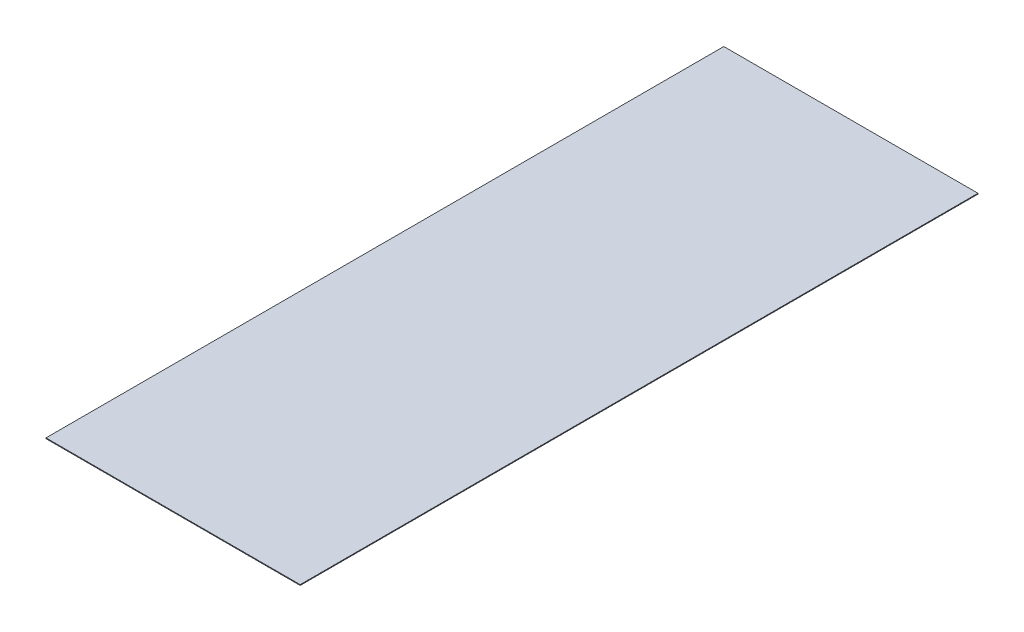
ISO-10303-21;
HEADER;
FILE_DESCRIPTION(('STEP AP214'),'2;1');
FILE_NAME('part.step','',(''),(''),'','','');
FILE_SCHEMA(('AUTOMOTIVE_DESIGN { 1 0 10303 214 1 1 1 1 }'));
ENDSEC;
DATA;
#1=APPLICATION_CONTEXT('core data for automotive mechanical design processes');
#2=APPLICATION_PROTOCOL_DEFINITION('international standard','automotive_design',2000,#1);
#3=PRODUCT_CONTEXT('',#1,'mechanical');
#4=PRODUCT('Part','Part','',(#3));
#5=PRODUCT_RELATED_PRODUCT_CATEGORY('part','',(#4));
#6=PRODUCT_DEFINITION_FORMATION('','',#4);
#7=PRODUCT_DEFINITION_CONTEXT('part definition',#1,'design');
#8=PRODUCT_DEFINITION('design','',#6,#7);
#9=PRODUCT_DEFINITION_SHAPE('','',#8);
#10=(LENGTH_UNIT() NAMED_UNIT(*) SI_UNIT(.MILLI.,.METRE.));
#11=(NAMED_UNIT(*) PLANE_ANGLE_UNIT() SI_UNIT($,.RADIAN.));
#12=(NAMED_UNIT(*) SI_UNIT($,.STERADIAN.) SOLID_ANGLE_UNIT());
#13=UNCERTAINTY_MEASURE_WITH_UNIT(LENGTH_MEASURE(1.E-05),#10,'distance_accuracy_value','');
#14=(GEOMETRIC_REPRESENTATION_CONTEXT(3) GLOBAL_UNCERTAINTY_ASSIGNED_CONTEXT((#13)) GLOBAL_UNIT_ASSIGNED_CONTEXT((#10,
#11,#12)) REPRESENTATION_CONTEXT('',''));
#15=CARTESIAN_POINT('',(0.,0.,0.));
#16=DIRECTION('',(0.,0.,1.));
#17=DIRECTION('',(1.,0.,0.));
#18=AXIS2_PLACEMENT_3D('',#15,#16,#17);
#19=CARTESIAN_POINT('',(457.2,2.7,1219.2));
#20=DIRECTION('',(-1.,0.,0.));
#21=DIRECTION('',(0.,0.,1.));
#22=AXIS2_PLACEMENT_3D('',#19,#20,#21);
#23=PLANE('',#22);
#24=DIRECTION('',(0.,0.,-1.));
#25=VECTOR('',#24,1.);
#26=CARTESIAN_POINT('',(457.2,0.,1219.2));
#27=LINE('',#26,#25);
#28=CARTESIAN_POINT('',(457.2,0.,1219.2));
#29=VERTEX_POINT('',#28);
#30=CARTESIAN_POINT('',(457.2,0.,-1219.2));
#31=VERTEX_POINT('',#30);
#32=EDGE_CURVE('E96',#29,#31,#27,.T.);
#33=ORIENTED_EDGE('',*,*,#32,.T.);
#34=DIRECTION('',(0.,-1.,0.));
#35=VECTOR('',#34,1.);
#36=CARTESIAN_POINT('',(457.2,2.7,-1219.2));
#37=LINE('',#36,#35);
#38=CARTESIAN_POINT('',(457.2,2.7,-1219.2));
#39=VERTEX_POINT('',#38);
#40=EDGE_CURVE('E11',#39,#31,#37,.T.);
#41=ORIENTED_EDGE('',*,*,#40,.F.);
#42=DIRECTION('',(0.,0.,-1.));
#43=VECTOR('',#42,1.);
#44=CARTESIAN_POINT('',(457.2,2.7,1219.2));
#45=LINE('',#44,#43);
#46=CARTESIAN_POINT('',(457.2,2.7,1219.2));
#47=VERTEX_POINT('',#46);
#48=EDGE_CURVE('E84',#47,#39,#45,.T.);
#49=ORIENTED_EDGE('',*,*,#48,.F.);
#50=DIRECTION('',(0.,-1.,0.));
#51=VECTOR('',#50,1.);
#52=CARTESIAN_POINT('',(457.2,2.7,1219.2));
#53=LINE('',#52,#51);
#54=EDGE_CURVE('E92',#47,#29,#53,.T.);
#55=ORIENTED_EDGE('',*,*,#54,.T.);
#56=EDGE_LOOP('',(#33,#41,#49,#55));
#57=FACE_BOUND('',#56,.T.);
#58=ADVANCED_FACE('F33',(#57),#23,.F.);
#59=CARTESIAN_POINT('',(-457.2,2.7,-1219.2));
#60=DIRECTION('',(0.,0.,1.));
#61=DIRECTION('',(1.,0.,0.));
#62=AXIS2_PLACEMENT_3D('',#59,#60,#61);
#63=PLANE('',#62);
#64=DIRECTION('',(-1.,0.,0.));
#65=VECTOR('',#64,1.);
#66=CARTESIAN_POINT('',(-457.2,0.,-1219.2));
#67=LINE('',#66,#65);
#68=CARTESIAN_POINT('',(-457.2,0.,-1219.2));
#69=VERTEX_POINT('',#68);
#70=EDGE_CURVE('E88',#31,#69,#67,.T.);
#71=ORIENTED_EDGE('',*,*,#70,.T.);
#72=DIRECTION('',(0.,-1.,0.));
#73=VECTOR('',#72,1.);
#74=CARTESIAN_POINT('',(-457.2,2.7,-1219.2));
#75=LINE('',#74,#73);
#76=CARTESIAN_POINT('',(-457.2,2.7,-1219.2));
#77=VERTEX_POINT('',#76);
#78=EDGE_CURVE('E41',#77,#69,#75,.T.);
#79=ORIENTED_EDGE('',*,*,#78,.F.);
#80=DIRECTION('',(-1.,0.,0.));
#81=VECTOR('',#80,1.);
#82=CARTESIAN_POINT('',(-457.2,2.7,-1219.2));
#83=LINE('',#82,#81);
#84=EDGE_CURVE('E79',#39,#77,#83,.T.);
#85=ORIENTED_EDGE('',*,*,#84,.F.);
#86=ORIENTED_EDGE('',*,*,#40,.T.);
#87=EDGE_LOOP('',(#71,#79,#85,#86));
#88=FACE_BOUND('',#87,.T.);
#89=ADVANCED_FACE('F87',(#88),#63,.F.);
#90=CARTESIAN_POINT('',(-457.2,2.7,1219.2));
#91=DIRECTION('',(1.,0.,0.));
#92=DIRECTION('',(0.,0.,-1.));
#93=AXIS2_PLACEMENT_3D('',#90,#91,#92);
#94=PLANE('',#93);
#95=DIRECTION('',(0.,0.,1.));
#96=VECTOR('',#95,1.);
#97=CARTESIAN_POINT('',(-457.2,0.,1219.2));
#98=LINE('',#97,#96);
#99=CARTESIAN_POINT('',(-457.2,0.,1219.2));
#100=VERTEX_POINT('',#99);
#101=EDGE_CURVE('E66',#69,#100,#98,.T.);
#102=ORIENTED_EDGE('',*,*,#101,.T.);
#103=DIRECTION('',(0.,-1.,0.));
#104=VECTOR('',#103,1.);
#105=CARTESIAN_POINT('',(-457.2,2.7,1219.2));
#106=LINE('',#105,#104);
#107=CARTESIAN_POINT('',(-457.2,2.7,1219.2));
#108=VERTEX_POINT('',#107);
#109=EDGE_CURVE('E89',#108,#100,#106,.T.);
#110=ORIENTED_EDGE('',*,*,#109,.F.);
#111=DIRECTION('',(0.,0.,1.));
#112=VECTOR('',#111,1.);
#113=CARTESIAN_POINT('',(-457.2,2.7,1219.2));
#114=LINE('',#113,#112);
#115=EDGE_CURVE('E82',#77,#108,#114,.T.);
#116=ORIENTED_EDGE('',*,*,#115,.F.);
#117=ORIENTED_EDGE('',*,*,#78,.T.);
#118=EDGE_LOOP('',(#102,#110,#116,#117));
#119=FACE_BOUND('',#118,.T.);
#120=ADVANCED_FACE('F90',(#119),#94,.F.);
#121=CARTESIAN_POINT('',(-457.2,2.7,1219.2));
#122=DIRECTION('',(0.,0.,-1.));
#123=DIRECTION('',(-1.,0.,0.));
#124=AXIS2_PLACEMENT_3D('',#121,#122,#123);
#125=PLANE('',#124);
#126=DIRECTION('',(1.,0.,0.));
#127=VECTOR('',#126,1.);
#128=CARTESIAN_POINT('',(-457.2,0.,1219.2));
#129=LINE('',#128,#127);
#130=EDGE_CURVE('E72',#100,#29,#129,.T.);
#131=ORIENTED_EDGE('',*,*,#130,.T.);
#132=ORIENTED_EDGE('',*,*,#54,.F.);
#133=DIRECTION('',(1.,0.,0.));
#134=VECTOR('',#133,1.);
#135=CARTESIAN_POINT('',(-457.2,2.7,1219.2));
#136=LINE('',#135,#134);
#137=EDGE_CURVE('E49',#108,#47,#136,.T.);
#138=ORIENTED_EDGE('',*,*,#137,.F.);
#139=ORIENTED_EDGE('',*,*,#109,.T.);
#140=EDGE_LOOP('',(#131,#132,#138,#139));
#141=FACE_BOUND('',#140,.T.);
#142=ADVANCED_FACE('F103',(#141),#125,.F.);
#143=CARTESIAN_POINT('',(0.,2.7,0.));
#144=DIRECTION('',(0.,-1.,0.));
#145=DIRECTION('',(0.,0.,-1.));
#146=AXIS2_PLACEMENT_3D('',#143,#144,#145);
#147=PLANE('',#146);
#148=ORIENTED_EDGE('',*,*,#48,.T.);
#149=ORIENTED_EDGE('',*,*,#84,.T.);
#150=ORIENTED_EDGE('',*,*,#115,.T.);
#151=ORIENTED_EDGE('',*,*,#137,.T.);
#152=EDGE_LOOP('',(#148,#149,#150,#151));
#153=FACE_BOUND('',#152,.T.);
#154=ADVANCED_FACE('F80',(#153),#147,.F.);
#155=CARTESIAN_POINT('',(0.,0.,0.));
#156=DIRECTION('',(0.,-1.,0.));
#157=DIRECTION('',(0.,0.,-1.));
#158=AXIS2_PLACEMENT_3D('',#155,#156,#157);
#159=PLANE('',#158);
#160=ORIENTED_EDGE('',*,*,#32,.F.);
#161=ORIENTED_EDGE('',*,*,#130,.F.);
#162=ORIENTED_EDGE('',*,*,#101,.F.);
#163=ORIENTED_EDGE('',*,*,#70,.F.);
#164=EDGE_LOOP('',(#160,#161,#162,#163));
#165=FACE_BOUND('',#164,.T.);
#166=ADVANCED_FACE('F106',(#165),#159,.T.);
#167=CLOSED_SHELL('',(#58,#89,#120,#142,#154,#166));
#168=MANIFOLD_SOLID_BREP('B2',#167);
#169=ADVANCED_BREP_SHAPE_REPRESENTATION('',(#18,#168),#14);
#170=SHAPE_DEFINITION_REPRESENTATION(#9,#169);
ENDSEC;
END-ISO-10303-21;
